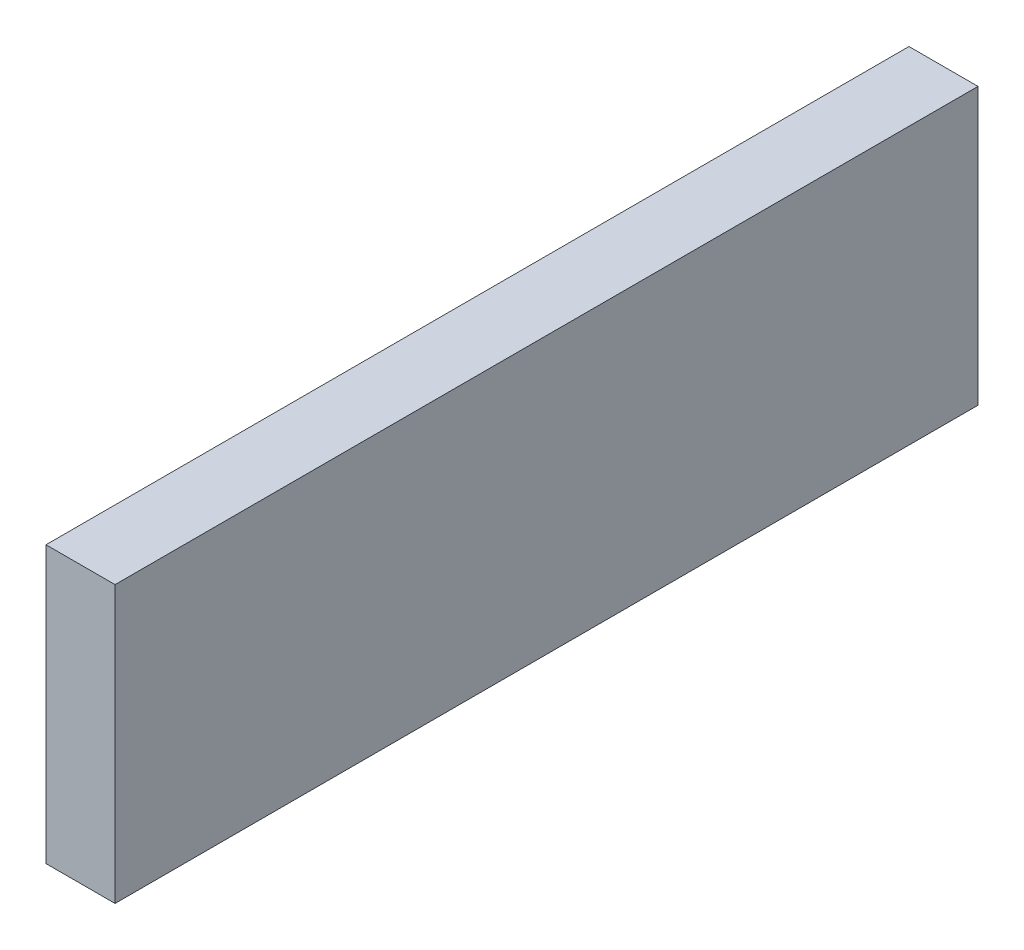
ISO-10303-21;
HEADER;
FILE_DESCRIPTION(('STEP AP214'),'2;1');
FILE_NAME('part.step','',(''),(''),'','','');
FILE_SCHEMA(('AUTOMOTIVE_DESIGN { 1 0 10303 214 1 1 1 1 }'));
ENDSEC;
DATA;
#1=APPLICATION_CONTEXT('core data for automotive mechanical design processes');
#2=APPLICATION_PROTOCOL_DEFINITION('international standard','automotive_design',2000,#1);
#3=PRODUCT_CONTEXT('',#1,'mechanical');
#4=PRODUCT('Part','Part','',(#3));
#5=PRODUCT_RELATED_PRODUCT_CATEGORY('part','',(#4));
#6=PRODUCT_DEFINITION_FORMATION('','',#4);
#7=PRODUCT_DEFINITION_CONTEXT('part definition',#1,'design');
#8=PRODUCT_DEFINITION('design','',#6,#7);
#9=PRODUCT_DEFINITION_SHAPE('','',#8);
#10=(LENGTH_UNIT() NAMED_UNIT(*) SI_UNIT(.MILLI.,.METRE.));
#11=(NAMED_UNIT(*) PLANE_ANGLE_UNIT() SI_UNIT($,.RADIAN.));
#12=(NAMED_UNIT(*) SI_UNIT($,.STERADIAN.) SOLID_ANGLE_UNIT());
#13=UNCERTAINTY_MEASURE_WITH_UNIT(LENGTH_MEASURE(1.E-05),#10,'distance_accuracy_value','');
#14=(GEOMETRIC_REPRESENTATION_CONTEXT(3) GLOBAL_UNCERTAINTY_ASSIGNED_CONTEXT((#13)) GLOBAL_UNIT_ASSIGNED_CONTEXT((#10,
#11,#12)) REPRESENTATION_CONTEXT('',''));
#15=CARTESIAN_POINT('',(0.,0.,0.));
#16=DIRECTION('',(0.,0.,1.));
#17=DIRECTION('',(1.,0.,0.));
#18=AXIS2_PLACEMENT_3D('',#15,#16,#17);
#19=CARTESIAN_POINT('',(-10.,-40.,250.));
#20=DIRECTION('',(1.,0.,0.));
#21=DIRECTION('',(0.,0.,-1.));
#22=AXIS2_PLACEMENT_3D('',#19,#20,#21);
#23=PLANE('',#22);
#24=DIRECTION('',(0.,-1.,0.));
#25=VECTOR('',#24,1.);
#26=CARTESIAN_POINT('',(-10.,-40.,0.));
#27=LINE('',#26,#25);
#28=CARTESIAN_POINT('',(-10.,40.,0.));
#29=VERTEX_POINT('',#28);
#30=CARTESIAN_POINT('',(-10.,-40.,0.));
#31=VERTEX_POINT('',#30);
#32=EDGE_CURVE('E104',#29,#31,#27,.T.);
#33=ORIENTED_EDGE('',*,*,#32,.T.);
#34=DIRECTION('',(0.,0.,-1.));
#35=VECTOR('',#34,1.);
#36=CARTESIAN_POINT('',(-10.,-40.,250.));
#37=LINE('',#36,#35);
#38=CARTESIAN_POINT('',(-10.,-40.,250.));
#39=VERTEX_POINT('',#38);
#40=EDGE_CURVE('E11',#39,#31,#37,.T.);
#41=ORIENTED_EDGE('',*,*,#40,.F.);
#42=DIRECTION('',(0.,-1.,0.));
#43=VECTOR('',#42,1.);
#44=CARTESIAN_POINT('',(-10.,-40.,250.));
#45=LINE('',#44,#43);
#46=CARTESIAN_POINT('',(-10.,40.,250.));
#47=VERTEX_POINT('',#46);
#48=EDGE_CURVE('E92',#47,#39,#45,.T.);
#49=ORIENTED_EDGE('',*,*,#48,.F.);
#50=DIRECTION('',(0.,0.,-1.));
#51=VECTOR('',#50,1.);
#52=CARTESIAN_POINT('',(-10.,40.,250.));
#53=LINE('',#52,#51);
#54=EDGE_CURVE('E100',#47,#29,#53,.T.);
#55=ORIENTED_EDGE('',*,*,#54,.T.);
#56=EDGE_LOOP('',(#33,#41,#49,#55));
#57=FACE_BOUND('',#56,.T.);
#58=ADVANCED_FACE('F41',(#57),#23,.F.);
#59=CARTESIAN_POINT('',(9.99999999999998,-40.,250.));
#60=DIRECTION('',(0.,1.,0.));
#61=DIRECTION('',(0.,0.,1.));
#62=AXIS2_PLACEMENT_3D('',#59,#60,#61);
#63=PLANE('',#62);
#64=DIRECTION('',(1.,0.,0.));
#65=VECTOR('',#64,1.);
#66=CARTESIAN_POINT('',(9.99999999999998,-40.,0.));
#67=LINE('',#66,#65);
#68=CARTESIAN_POINT('',(9.99999999999998,-40.,0.));
#69=VERTEX_POINT('',#68);
#70=EDGE_CURVE('E96',#31,#69,#67,.T.);
#71=ORIENTED_EDGE('',*,*,#70,.T.);
#72=DIRECTION('',(0.,0.,-1.));
#73=VECTOR('',#72,1.);
#74=CARTESIAN_POINT('',(9.99999999999998,-40.,250.));
#75=LINE('',#74,#73);
#76=CARTESIAN_POINT('',(9.99999999999998,-40.,250.));
#77=VERTEX_POINT('',#76);
#78=EDGE_CURVE('E49',#77,#69,#75,.T.);
#79=ORIENTED_EDGE('',*,*,#78,.F.);
#80=DIRECTION('',(1.,0.,0.));
#81=VECTOR('',#80,1.);
#82=CARTESIAN_POINT('',(9.99999999999998,-40.,250.));
#83=LINE('',#82,#81);
#84=EDGE_CURVE('E87',#39,#77,#83,.T.);
#85=ORIENTED_EDGE('',*,*,#84,.F.);
#86=ORIENTED_EDGE('',*,*,#40,.T.);
#87=EDGE_LOOP('',(#71,#79,#85,#86));
#88=FACE_BOUND('',#87,.T.);
#89=ADVANCED_FACE('F95',(#88),#63,.F.);
#90=CARTESIAN_POINT('',(9.99999999999998,-40.,250.));
#91=DIRECTION('',(-1.,0.,0.));
#92=DIRECTION('',(0.,0.,1.));
#93=AXIS2_PLACEMENT_3D('',#90,#91,#92);
#94=PLANE('',#93);
#95=DIRECTION('',(0.,1.,0.));
#96=VECTOR('',#95,1.);
#97=CARTESIAN_POINT('',(9.99999999999998,-40.,0.));
#98=LINE('',#97,#96);
#99=CARTESIAN_POINT('',(9.99999999999998,40.,0.));
#100=VERTEX_POINT('',#99);
#101=EDGE_CURVE('E74',#69,#100,#98,.T.);
#102=ORIENTED_EDGE('',*,*,#101,.T.);
#103=DIRECTION('',(0.,0.,-1.));
#104=VECTOR('',#103,1.);
#105=CARTESIAN_POINT('',(9.99999999999998,40.,250.));
#106=LINE('',#105,#104);
#107=CARTESIAN_POINT('',(9.99999999999998,40.,250.));
#108=VERTEX_POINT('',#107);
#109=EDGE_CURVE('E97',#108,#100,#106,.T.);
#110=ORIENTED_EDGE('',*,*,#109,.F.);
#111=DIRECTION('',(0.,1.,0.));
#112=VECTOR('',#111,1.);
#113=CARTESIAN_POINT('',(9.99999999999998,-40.,250.));
#114=LINE('',#113,#112);
#115=EDGE_CURVE('E90',#77,#108,#114,.T.);
#116=ORIENTED_EDGE('',*,*,#115,.F.);
#117=ORIENTED_EDGE('',*,*,#78,.T.);
#118=EDGE_LOOP('',(#102,#110,#116,#117));
#119=FACE_BOUND('',#118,.T.);
#120=ADVANCED_FACE('F98',(#119),#94,.F.);
#121=CARTESIAN_POINT('',(9.99999999999998,40.,250.));
#122=DIRECTION('',(0.,-1.,0.));
#123=DIRECTION('',(1.,0.,0.));
#124=AXIS2_PLACEMENT_3D('',#121,#122,#123);
#125=PLANE('',#124);
#126=DIRECTION('',(-1.,0.,0.));
#127=VECTOR('',#126,1.);
#128=CARTESIAN_POINT('',(9.99999999999998,40.,0.));
#129=LINE('',#128,#127);
#130=EDGE_CURVE('E80',#100,#29,#129,.T.);
#131=ORIENTED_EDGE('',*,*,#130,.T.);
#132=ORIENTED_EDGE('',*,*,#54,.F.);
#133=DIRECTION('',(-1.,0.,0.));
#134=VECTOR('',#133,1.);
#135=CARTESIAN_POINT('',(9.99999999999998,40.,250.));
#136=LINE('',#135,#134);
#137=EDGE_CURVE('E57',#108,#47,#136,.T.);
#138=ORIENTED_EDGE('',*,*,#137,.F.);
#139=ORIENTED_EDGE('',*,*,#109,.T.);
#140=EDGE_LOOP('',(#131,#132,#138,#139));
#141=FACE_BOUND('',#140,.T.);
#142=ADVANCED_FACE('F111',(#141),#125,.F.);
#143=CARTESIAN_POINT('',(0.,0.,250.));
#144=DIRECTION('',(0.,0.,1.));
#145=DIRECTION('',(1.,0.,0.));
#146=AXIS2_PLACEMENT_3D('',#143,#144,#145);
#147=PLANE('',#146);
#148=ORIENTED_EDGE('',*,*,#48,.T.);
#149=ORIENTED_EDGE('',*,*,#84,.T.);
#150=ORIENTED_EDGE('',*,*,#115,.T.);
#151=ORIENTED_EDGE('',*,*,#137,.T.);
#152=EDGE_LOOP('',(#148,#149,#150,#151));
#153=FACE_BOUND('',#152,.T.);
#154=ADVANCED_FACE('F88',(#153),#147,.T.);
#155=CARTESIAN_POINT('',(0.,0.,0.));
#156=DIRECTION('',(0.,0.,1.));
#157=DIRECTION('',(1.,0.,0.));
#158=AXIS2_PLACEMENT_3D('',#155,#156,#157);
#159=PLANE('',#158);
#160=ORIENTED_EDGE('',*,*,#32,.F.);
#161=ORIENTED_EDGE('',*,*,#130,.F.);
#162=ORIENTED_EDGE('',*,*,#101,.F.);
#163=ORIENTED_EDGE('',*,*,#70,.F.);
#164=EDGE_LOOP('',(#160,#161,#162,#163));
#165=FACE_BOUND('',#164,.T.);
#166=ADVANCED_FACE('F114',(#165),#159,.F.);
#167=CLOSED_SHELL('',(#58,#89,#120,#142,#154,#166));
#168=MANIFOLD_SOLID_BREP('B2',#167);
#169=ADVANCED_BREP_SHAPE_REPRESENTATION('',(#18,#168),#14);
#170=SHAPE_DEFINITION_REPRESENTATION(#9,#169);
ENDSEC;
END-ISO-10303-21;
